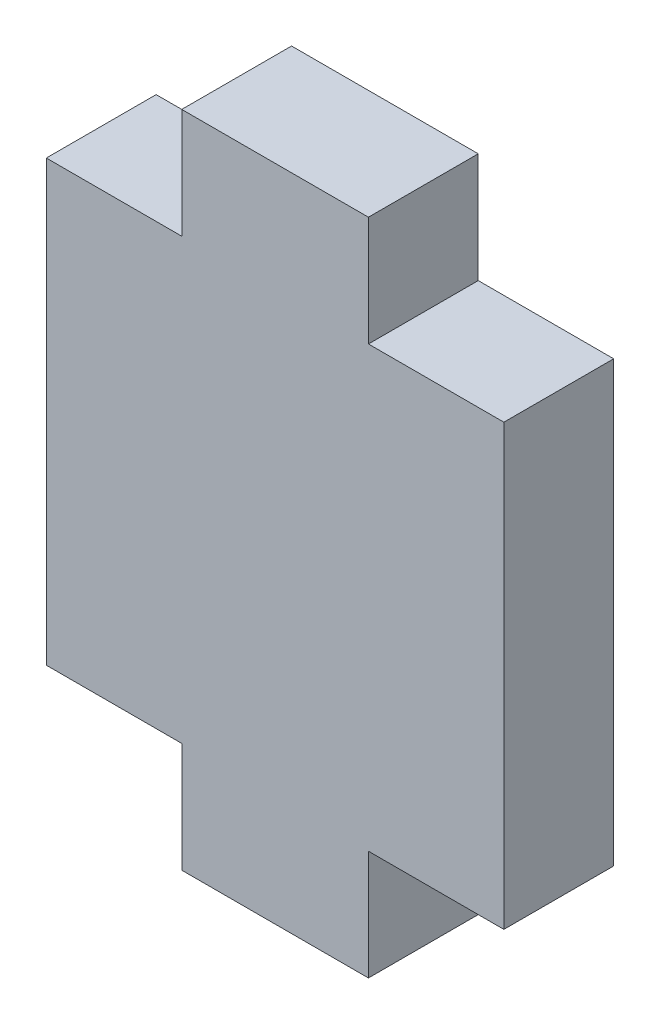
ISO-10303-21;
HEADER;
FILE_DESCRIPTION(('STEP AP214'),'2;1');
FILE_NAME('part.step','',(''),(''),'','','');
FILE_SCHEMA(('AUTOMOTIVE_DESIGN { 1 0 10303 214 1 1 1 1 }'));
ENDSEC;
DATA;
#1=APPLICATION_CONTEXT('core data for automotive mechanical design processes');
#2=APPLICATION_PROTOCOL_DEFINITION('international standard','automotive_design',2000,#1);
#3=PRODUCT_CONTEXT('',#1,'mechanical');
#4=PRODUCT('Part','Part','',(#3));
#5=PRODUCT_RELATED_PRODUCT_CATEGORY('part','',(#4));
#6=PRODUCT_DEFINITION_FORMATION('','',#4);
#7=PRODUCT_DEFINITION_CONTEXT('part definition',#1,'design');
#8=PRODUCT_DEFINITION('design','',#6,#7);
#9=PRODUCT_DEFINITION_SHAPE('','',#8);
#10=(LENGTH_UNIT() NAMED_UNIT(*) SI_UNIT(.MILLI.,.METRE.));
#11=(NAMED_UNIT(*) PLANE_ANGLE_UNIT() SI_UNIT($,.RADIAN.));
#12=(NAMED_UNIT(*) SI_UNIT($,.STERADIAN.) SOLID_ANGLE_UNIT());
#13=UNCERTAINTY_MEASURE_WITH_UNIT(LENGTH_MEASURE(1.E-05),#10,'distance_accuracy_value','');
#14=(GEOMETRIC_REPRESENTATION_CONTEXT(3) GLOBAL_UNCERTAINTY_ASSIGNED_CONTEXT((#13)) GLOBAL_UNIT_ASSIGNED_CONTEXT((#10,
#11,#12)) REPRESENTATION_CONTEXT('',''));
#15=CARTESIAN_POINT('',(0.,0.,0.));
#16=DIRECTION('',(0.,0.,1.));
#17=DIRECTION('',(1.,0.,0.));
#18=AXIS2_PLACEMENT_3D('',#15,#16,#17);
#19=CARTESIAN_POINT('',(10.2,0.,6.));
#20=DIRECTION('',(0.,1.,0.));
#21=DIRECTION('',(-1.,0.,0.));
#22=AXIS2_PLACEMENT_3D('',#19,#20,#21);
#23=PLANE('',#22);
#24=DIRECTION('',(1.,0.,0.));
#25=VECTOR('',#24,1.);
#26=CARTESIAN_POINT('',(10.2,0.,0.));
#27=LINE('',#26,#25);
#28=CARTESIAN_POINT('',(0.,0.,0.));
#29=VERTEX_POINT('',#28);
#30=CARTESIAN_POINT('',(10.2,0.,0.));
#31=VERTEX_POINT('',#30);
#32=EDGE_CURVE('E174',#29,#31,#27,.T.);
#33=ORIENTED_EDGE('',*,*,#32,.T.);
#34=DIRECTION('',(0.,0.,-1.));
#35=VECTOR('',#34,1.);
#36=CARTESIAN_POINT('',(10.2,0.,6.));
#37=LINE('',#36,#35);
#38=CARTESIAN_POINT('',(10.2,0.,6.));
#39=VERTEX_POINT('',#38);
#40=EDGE_CURVE('E11',#39,#31,#37,.T.);
#41=ORIENTED_EDGE('',*,*,#40,.F.);
#42=DIRECTION('',(1.,0.,0.));
#43=VECTOR('',#42,1.);
#44=CARTESIAN_POINT('',(10.2,0.,6.));
#45=LINE('',#44,#43);
#46=CARTESIAN_POINT('',(0.,0.,6.));
#47=VERTEX_POINT('',#46);
#48=EDGE_CURVE('E207',#47,#39,#45,.T.);
#49=ORIENTED_EDGE('',*,*,#48,.F.);
#50=DIRECTION('',(0.,0.,-1.));
#51=VECTOR('',#50,1.);
#52=CARTESIAN_POINT('',(0.,0.,6.));
#53=LINE('',#52,#51);
#54=EDGE_CURVE('E170',#47,#29,#53,.T.);
#55=ORIENTED_EDGE('',*,*,#54,.T.);
#56=EDGE_LOOP('',(#33,#41,#49,#55));
#57=FACE_BOUND('',#56,.T.);
#58=ADVANCED_FACE('F47',(#57),#23,.F.);
#59=CARTESIAN_POINT('',(10.2,6.,6.));
#60=DIRECTION('',(-1.,0.,0.));
#61=DIRECTION('',(0.,-1.,0.));
#62=AXIS2_PLACEMENT_3D('',#59,#60,#61);
#63=PLANE('',#62);
#64=DIRECTION('',(0.,1.,0.));
#65=VECTOR('',#64,1.);
#66=CARTESIAN_POINT('',(10.2,6.,0.));
#67=LINE('',#66,#65);
#68=CARTESIAN_POINT('',(10.2,6.,0.));
#69=VERTEX_POINT('',#68);
#70=EDGE_CURVE('E178',#31,#69,#67,.T.);
#71=ORIENTED_EDGE('',*,*,#70,.T.);
#72=DIRECTION('',(0.,0.,-1.));
#73=VECTOR('',#72,1.);
#74=CARTESIAN_POINT('',(10.2,6.,6.));
#75=LINE('',#74,#73);
#76=CARTESIAN_POINT('',(10.2,6.,6.));
#77=VERTEX_POINT('',#76);
#78=EDGE_CURVE('E56',#77,#69,#75,.T.);
#79=ORIENTED_EDGE('',*,*,#78,.F.);
#80=DIRECTION('',(0.,1.,0.));
#81=VECTOR('',#80,1.);
#82=CARTESIAN_POINT('',(10.2,6.,6.));
#83=LINE('',#82,#81);
#84=EDGE_CURVE('E119',#39,#77,#83,.T.);
#85=ORIENTED_EDGE('',*,*,#84,.F.);
#86=ORIENTED_EDGE('',*,*,#40,.T.);
#87=EDGE_LOOP('',(#71,#79,#85,#86));
#88=FACE_BOUND('',#87,.T.);
#89=ADVANCED_FACE('F284',(#88),#63,.F.);
#90=CARTESIAN_POINT('',(17.6,6.,6.));
#91=DIRECTION('',(0.,1.,0.));
#92=DIRECTION('',(-1.,0.,0.));
#93=AXIS2_PLACEMENT_3D('',#90,#91,#92);
#94=PLANE('',#93);
#95=DIRECTION('',(1.,0.,0.));
#96=VECTOR('',#95,1.);
#97=CARTESIAN_POINT('',(17.6,6.,0.));
#98=LINE('',#97,#96);
#99=CARTESIAN_POINT('',(17.6,6.,0.));
#100=VERTEX_POINT('',#99);
#101=EDGE_CURVE('E181',#69,#100,#98,.T.);
#102=ORIENTED_EDGE('',*,*,#101,.T.);
#103=DIRECTION('',(0.,0.,-1.));
#104=VECTOR('',#103,1.);
#105=CARTESIAN_POINT('',(17.6,6.,6.));
#106=LINE('',#105,#104);
#107=CARTESIAN_POINT('',(17.6,6.,6.));
#108=VERTEX_POINT('',#107);
#109=EDGE_CURVE('E234',#108,#100,#106,.T.);
#110=ORIENTED_EDGE('',*,*,#109,.F.);
#111=DIRECTION('',(1.,0.,0.));
#112=VECTOR('',#111,1.);
#113=CARTESIAN_POINT('',(17.6,6.,6.));
#114=LINE('',#113,#112);
#115=EDGE_CURVE('E245',#77,#108,#114,.T.);
#116=ORIENTED_EDGE('',*,*,#115,.F.);
#117=ORIENTED_EDGE('',*,*,#78,.T.);
#118=EDGE_LOOP('',(#102,#110,#116,#117));
#119=FACE_BOUND('',#118,.T.);
#120=ADVANCED_FACE('F243',(#119),#94,.F.);
#121=CARTESIAN_POINT('',(17.6,30.,6.));
#122=DIRECTION('',(-1.,0.,0.));
#123=DIRECTION('',(0.,0.,1.));
#124=AXIS2_PLACEMENT_3D('',#121,#122,#123);
#125=PLANE('',#124);
#126=DIRECTION('',(0.,1.,0.));
#127=VECTOR('',#126,1.);
#128=CARTESIAN_POINT('',(17.6,30.,0.));
#129=LINE('',#128,#127);
#130=CARTESIAN_POINT('',(17.6,30.,0.));
#131=VERTEX_POINT('',#130);
#132=EDGE_CURVE('E184',#100,#131,#129,.T.);
#133=ORIENTED_EDGE('',*,*,#132,.T.);
#134=DIRECTION('',(0.,0.,-1.));
#135=VECTOR('',#134,1.);
#136=CARTESIAN_POINT('',(17.6,30.,6.));
#137=LINE('',#136,#135);
#138=CARTESIAN_POINT('',(17.6,30.,6.));
#139=VERTEX_POINT('',#138);
#140=EDGE_CURVE('E230',#139,#131,#137,.T.);
#141=ORIENTED_EDGE('',*,*,#140,.F.);
#142=DIRECTION('',(0.,1.,0.));
#143=VECTOR('',#142,1.);
#144=CARTESIAN_POINT('',(17.6,30.,6.));
#145=LINE('',#144,#143);
#146=EDGE_CURVE('E263',#108,#139,#145,.T.);
#147=ORIENTED_EDGE('',*,*,#146,.F.);
#148=ORIENTED_EDGE('',*,*,#109,.T.);
#149=EDGE_LOOP('',(#133,#141,#147,#148));
#150=FACE_BOUND('',#149,.T.);
#151=ADVANCED_FACE('F254',(#150),#125,.F.);
#152=CARTESIAN_POINT('',(10.2,30.,6.));
#153=DIRECTION('',(0.,-1.,0.));
#154=DIRECTION('',(0.,0.,-1.));
#155=AXIS2_PLACEMENT_3D('',#152,#153,#154);
#156=PLANE('',#155);
#157=DIRECTION('',(-1.,0.,0.));
#158=VECTOR('',#157,1.);
#159=CARTESIAN_POINT('',(10.2,30.,0.));
#160=LINE('',#159,#158);
#161=CARTESIAN_POINT('',(10.2,30.,0.));
#162=VERTEX_POINT('',#161);
#163=EDGE_CURVE('E187',#131,#162,#160,.T.);
#164=ORIENTED_EDGE('',*,*,#163,.T.);
#165=DIRECTION('',(0.,0.,-1.));
#166=VECTOR('',#165,1.);
#167=CARTESIAN_POINT('',(10.2,30.,6.));
#168=LINE('',#167,#166);
#169=CARTESIAN_POINT('',(10.2,30.,6.));
#170=VERTEX_POINT('',#169);
#171=EDGE_CURVE('E226',#170,#162,#168,.T.);
#172=ORIENTED_EDGE('',*,*,#171,.F.);
#173=DIRECTION('',(-1.,0.,0.));
#174=VECTOR('',#173,1.);
#175=CARTESIAN_POINT('',(10.2,30.,6.));
#176=LINE('',#175,#174);
#177=EDGE_CURVE('E260',#139,#170,#176,.T.);
#178=ORIENTED_EDGE('',*,*,#177,.F.);
#179=ORIENTED_EDGE('',*,*,#140,.T.);
#180=EDGE_LOOP('',(#164,#172,#178,#179));
#181=FACE_BOUND('',#180,.T.);
#182=ADVANCED_FACE('F258',(#181),#156,.F.);
#183=CARTESIAN_POINT('',(10.2,36.,6.));
#184=DIRECTION('',(-1.,0.,0.));
#185=DIRECTION('',(0.,0.,1.));
#186=AXIS2_PLACEMENT_3D('',#183,#184,#185);
#187=PLANE('',#186);
#188=DIRECTION('',(0.,1.,0.));
#189=VECTOR('',#188,1.);
#190=CARTESIAN_POINT('',(10.2,36.,0.));
#191=LINE('',#190,#189);
#192=CARTESIAN_POINT('',(10.2,36.,0.));
#193=VERTEX_POINT('',#192);
#194=EDGE_CURVE('E189',#162,#193,#191,.T.);
#195=ORIENTED_EDGE('',*,*,#194,.T.);
#196=DIRECTION('',(0.,0.,-1.));
#197=VECTOR('',#196,1.);
#198=CARTESIAN_POINT('',(10.2,36.,6.));
#199=LINE('',#198,#197);
#200=CARTESIAN_POINT('',(10.2,36.,6.));
#201=VERTEX_POINT('',#200);
#202=EDGE_CURVE('E222',#201,#193,#199,.T.);
#203=ORIENTED_EDGE('',*,*,#202,.F.);
#204=DIRECTION('',(0.,1.,0.));
#205=VECTOR('',#204,1.);
#206=CARTESIAN_POINT('',(10.2,36.,6.));
#207=LINE('',#206,#205);
#208=EDGE_CURVE('E262',#170,#201,#207,.T.);
#209=ORIENTED_EDGE('',*,*,#208,.F.);
#210=ORIENTED_EDGE('',*,*,#171,.T.);
#211=EDGE_LOOP('',(#195,#203,#209,#210));
#212=FACE_BOUND('',#211,.T.);
#213=ADVANCED_FACE('F295',(#212),#187,.F.);
#214=CARTESIAN_POINT('',(0.,36.,6.));
#215=DIRECTION('',(0.,-1.,0.));
#216=DIRECTION('',(1.,0.,0.));
#217=AXIS2_PLACEMENT_3D('',#214,#215,#216);
#218=PLANE('',#217);
#219=DIRECTION('',(-1.,0.,0.));
#220=VECTOR('',#219,1.);
#221=CARTESIAN_POINT('',(0.,36.,0.));
#222=LINE('',#221,#220);
#223=CARTESIAN_POINT('',(0.,36.,0.));
#224=VERTEX_POINT('',#223);
#225=EDGE_CURVE('E192',#193,#224,#222,.T.);
#226=ORIENTED_EDGE('',*,*,#225,.T.);
#227=DIRECTION('',(0.,0.,-1.));
#228=VECTOR('',#227,1.);
#229=CARTESIAN_POINT('',(0.,36.,6.));
#230=LINE('',#229,#228);
#231=CARTESIAN_POINT('',(0.,36.,6.));
#232=VERTEX_POINT('',#231);
#233=EDGE_CURVE('E218',#232,#224,#230,.T.);
#234=ORIENTED_EDGE('',*,*,#233,.F.);
#235=DIRECTION('',(-1.,0.,0.));
#236=VECTOR('',#235,1.);
#237=CARTESIAN_POINT('',(0.,36.,6.));
#238=LINE('',#237,#236);
#239=EDGE_CURVE('E266',#201,#232,#238,.T.);
#240=ORIENTED_EDGE('',*,*,#239,.F.);
#241=ORIENTED_EDGE('',*,*,#202,.T.);
#242=EDGE_LOOP('',(#226,#234,#240,#241));
#243=FACE_BOUND('',#242,.T.);
#244=ADVANCED_FACE('F298',(#243),#218,.F.);
#245=CARTESIAN_POINT('',(0.,30.,6.));
#246=DIRECTION('',(1.,0.,0.));
#247=DIRECTION('',(0.,0.,-1.));
#248=AXIS2_PLACEMENT_3D('',#245,#246,#247);
#249=PLANE('',#248);
#250=DIRECTION('',(0.,-1.,0.));
#251=VECTOR('',#250,1.);
#252=CARTESIAN_POINT('',(0.,30.,0.));
#253=LINE('',#252,#251);
#254=CARTESIAN_POINT('',(0.,30.,0.));
#255=VERTEX_POINT('',#254);
#256=EDGE_CURVE('E195',#224,#255,#253,.T.);
#257=ORIENTED_EDGE('',*,*,#256,.T.);
#258=DIRECTION('',(0.,0.,-1.));
#259=VECTOR('',#258,1.);
#260=CARTESIAN_POINT('',(0.,30.,6.));
#261=LINE('',#260,#259);
#262=CARTESIAN_POINT('',(0.,30.,6.));
#263=VERTEX_POINT('',#262);
#264=EDGE_CURVE('E214',#263,#255,#261,.T.);
#265=ORIENTED_EDGE('',*,*,#264,.F.);
#266=DIRECTION('',(0.,-1.,0.));
#267=VECTOR('',#266,1.);
#268=CARTESIAN_POINT('',(0.,30.,6.));
#269=LINE('',#268,#267);
#270=EDGE_CURVE('E274',#232,#263,#269,.T.);
#271=ORIENTED_EDGE('',*,*,#270,.F.);
#272=ORIENTED_EDGE('',*,*,#233,.T.);
#273=EDGE_LOOP('',(#257,#265,#271,#272));
#274=FACE_BOUND('',#273,.T.);
#275=ADVANCED_FACE('F302',(#274),#249,.F.);
#276=CARTESIAN_POINT('',(-7.40000000000001,30.,6.));
#277=DIRECTION('',(0.,-1.,0.));
#278=DIRECTION('',(0.,0.,-1.));
#279=AXIS2_PLACEMENT_3D('',#276,#277,#278);
#280=PLANE('',#279);
#281=DIRECTION('',(-1.,0.,0.));
#282=VECTOR('',#281,1.);
#283=CARTESIAN_POINT('',(-7.40000000000001,30.,0.));
#284=LINE('',#283,#282);
#285=CARTESIAN_POINT('',(-7.40000000000001,30.,0.));
#286=VERTEX_POINT('',#285);
#287=EDGE_CURVE('E198',#255,#286,#284,.T.);
#288=ORIENTED_EDGE('',*,*,#287,.T.);
#289=DIRECTION('',(0.,0.,-1.));
#290=VECTOR('',#289,1.);
#291=CARTESIAN_POINT('',(-7.40000000000001,30.,6.));
#292=LINE('',#291,#290);
#293=CARTESIAN_POINT('',(-7.40000000000001,30.,6.));
#294=VERTEX_POINT('',#293);
#295=EDGE_CURVE('E161',#294,#286,#292,.T.);
#296=ORIENTED_EDGE('',*,*,#295,.F.);
#297=DIRECTION('',(-1.,0.,0.));
#298=VECTOR('',#297,1.);
#299=CARTESIAN_POINT('',(-7.40000000000001,30.,6.));
#300=LINE('',#299,#298);
#301=EDGE_CURVE('E150',#263,#294,#300,.T.);
#302=ORIENTED_EDGE('',*,*,#301,.F.);
#303=ORIENTED_EDGE('',*,*,#264,.T.);
#304=EDGE_LOOP('',(#288,#296,#302,#303));
#305=FACE_BOUND('',#304,.T.);
#306=ADVANCED_FACE('F306',(#305),#280,.F.);
#307=CARTESIAN_POINT('',(-7.40000000000001,6.,6.));
#308=DIRECTION('',(1.,0.,0.));
#309=DIRECTION('',(0.,0.,-1.));
#310=AXIS2_PLACEMENT_3D('',#307,#308,#309);
#311=PLANE('',#310);
#312=DIRECTION('',(0.,-1.,0.));
#313=VECTOR('',#312,1.);
#314=CARTESIAN_POINT('',(-7.40000000000001,6.,0.));
#315=LINE('',#314,#313);
#316=CARTESIAN_POINT('',(-7.40000000000001,6.,0.));
#317=VERTEX_POINT('',#316);
#318=EDGE_CURVE('E159',#286,#317,#315,.T.);
#319=ORIENTED_EDGE('',*,*,#318,.T.);
#320=DIRECTION('',(0.,0.,-1.));
#321=VECTOR('',#320,1.);
#322=CARTESIAN_POINT('',(-7.40000000000001,6.,6.));
#323=LINE('',#322,#321);
#324=CARTESIAN_POINT('',(-7.40000000000001,6.,6.));
#325=VERTEX_POINT('',#324);
#326=EDGE_CURVE('E156',#325,#317,#323,.T.);
#327=ORIENTED_EDGE('',*,*,#326,.F.);
#328=DIRECTION('',(0.,-1.,0.));
#329=VECTOR('',#328,1.);
#330=CARTESIAN_POINT('',(-7.40000000000001,6.,6.));
#331=LINE('',#330,#329);
#332=EDGE_CURVE('E144',#294,#325,#331,.T.);
#333=ORIENTED_EDGE('',*,*,#332,.F.);
#334=ORIENTED_EDGE('',*,*,#295,.T.);
#335=EDGE_LOOP('',(#319,#327,#333,#334));
#336=FACE_BOUND('',#335,.T.);
#337=ADVANCED_FACE('F157',(#336),#311,.F.);
#338=CARTESIAN_POINT('',(0.,6.,6.));
#339=DIRECTION('',(0.,1.,0.));
#340=DIRECTION('',(0.,0.,1.));
#341=AXIS2_PLACEMENT_3D('',#338,#339,#340);
#342=PLANE('',#341);
#343=DIRECTION('',(1.,0.,0.));
#344=VECTOR('',#343,1.);
#345=CARTESIAN_POINT('',(0.,6.,0.));
#346=LINE('',#345,#344);
#347=CARTESIAN_POINT('',(0.,6.,0.));
#348=VERTEX_POINT('',#347);
#349=EDGE_CURVE('E105',#317,#348,#346,.T.);
#350=ORIENTED_EDGE('',*,*,#349,.T.);
#351=DIRECTION('',(0.,0.,-1.));
#352=VECTOR('',#351,1.);
#353=CARTESIAN_POINT('',(0.,6.,6.));
#354=LINE('',#353,#352);
#355=CARTESIAN_POINT('',(0.,6.,6.));
#356=VERTEX_POINT('',#355);
#357=EDGE_CURVE('E162',#356,#348,#354,.T.);
#358=ORIENTED_EDGE('',*,*,#357,.F.);
#359=DIRECTION('',(1.,0.,0.));
#360=VECTOR('',#359,1.);
#361=CARTESIAN_POINT('',(0.,6.,6.));
#362=LINE('',#361,#360);
#363=EDGE_CURVE('E148',#325,#356,#362,.T.);
#364=ORIENTED_EDGE('',*,*,#363,.F.);
#365=ORIENTED_EDGE('',*,*,#326,.T.);
#366=EDGE_LOOP('',(#350,#358,#364,#365));
#367=FACE_BOUND('',#366,.T.);
#368=ADVANCED_FACE('F164',(#367),#342,.F.);
#369=CARTESIAN_POINT('',(0.,0.,6.));
#370=DIRECTION('',(1.,0.,0.));
#371=DIRECTION('',(0.,0.,-1.));
#372=AXIS2_PLACEMENT_3D('',#369,#370,#371);
#373=PLANE('',#372);
#374=DIRECTION('',(0.,-1.,0.));
#375=VECTOR('',#374,1.);
#376=CARTESIAN_POINT('',(0.,0.,0.));
#377=LINE('',#376,#375);
#378=EDGE_CURVE('E111',#348,#29,#377,.T.);
#379=ORIENTED_EDGE('',*,*,#378,.T.);
#380=ORIENTED_EDGE('',*,*,#54,.F.);
#381=DIRECTION('',(0.,-1.,0.));
#382=VECTOR('',#381,1.);
#383=CARTESIAN_POINT('',(0.,0.,6.));
#384=LINE('',#383,#382);
#385=EDGE_CURVE('E64',#356,#47,#384,.T.);
#386=ORIENTED_EDGE('',*,*,#385,.F.);
#387=ORIENTED_EDGE('',*,*,#357,.T.);
#388=EDGE_LOOP('',(#379,#380,#386,#387));
#389=FACE_BOUND('',#388,.T.);
#390=ADVANCED_FACE('F315',(#389),#373,.F.);
#391=CARTESIAN_POINT('',(0.,0.,6.));
#392=DIRECTION('',(0.,0.,-1.));
#393=DIRECTION('',(-1.,0.,0.));
#394=AXIS2_PLACEMENT_3D('',#391,#392,#393);
#395=PLANE('',#394);
#396=ORIENTED_EDGE('',*,*,#48,.T.);
#397=ORIENTED_EDGE('',*,*,#84,.T.);
#398=ORIENTED_EDGE('',*,*,#115,.T.);
#399=ORIENTED_EDGE('',*,*,#146,.T.);
#400=ORIENTED_EDGE('',*,*,#177,.T.);
#401=ORIENTED_EDGE('',*,*,#208,.T.);
#402=ORIENTED_EDGE('',*,*,#239,.T.);
#403=ORIENTED_EDGE('',*,*,#270,.T.);
#404=ORIENTED_EDGE('',*,*,#301,.T.);
#405=ORIENTED_EDGE('',*,*,#332,.T.);
#406=ORIENTED_EDGE('',*,*,#363,.T.);
#407=ORIENTED_EDGE('',*,*,#385,.T.);
#408=EDGE_LOOP('',(#396,#397,#398,#399,#400,#401,#402,#403,#404,#405,#406,#407));
#409=FACE_BOUND('',#408,.T.);
#410=ADVANCED_FACE('F146',(#409),#395,.F.);
#411=CARTESIAN_POINT('',(0.,0.,0.));
#412=DIRECTION('',(0.,0.,-1.));
#413=DIRECTION('',(-1.,0.,0.));
#414=AXIS2_PLACEMENT_3D('',#411,#412,#413);
#415=PLANE('',#414);
#416=ORIENTED_EDGE('',*,*,#32,.F.);
#417=ORIENTED_EDGE('',*,*,#378,.F.);
#418=ORIENTED_EDGE('',*,*,#349,.F.);
#419=ORIENTED_EDGE('',*,*,#318,.F.);
#420=ORIENTED_EDGE('',*,*,#287,.F.);
#421=ORIENTED_EDGE('',*,*,#256,.F.);
#422=ORIENTED_EDGE('',*,*,#225,.F.);
#423=ORIENTED_EDGE('',*,*,#194,.F.);
#424=ORIENTED_EDGE('',*,*,#163,.F.);
#425=ORIENTED_EDGE('',*,*,#132,.F.);
#426=ORIENTED_EDGE('',*,*,#101,.F.);
#427=ORIENTED_EDGE('',*,*,#70,.F.);
#428=EDGE_LOOP('',(#416,#417,#418,#419,#420,#421,#422,#423,#424,#425,#426,#427));
#429=FACE_BOUND('',#428,.T.);
#430=ADVANCED_FACE('F249',(#429),#415,.T.);
#431=CLOSED_SHELL('',(#58,#89,#120,#151,#182,#213,#244,#275,#306,#337,#368,#390,#410,#430));
#432=MANIFOLD_SOLID_BREP('B2',#431);
#433=ADVANCED_BREP_SHAPE_REPRESENTATION('',(#18,#432),#14);
#434=SHAPE_DEFINITION_REPRESENTATION(#9,#433);
ENDSEC;
END-ISO-10303-21;
